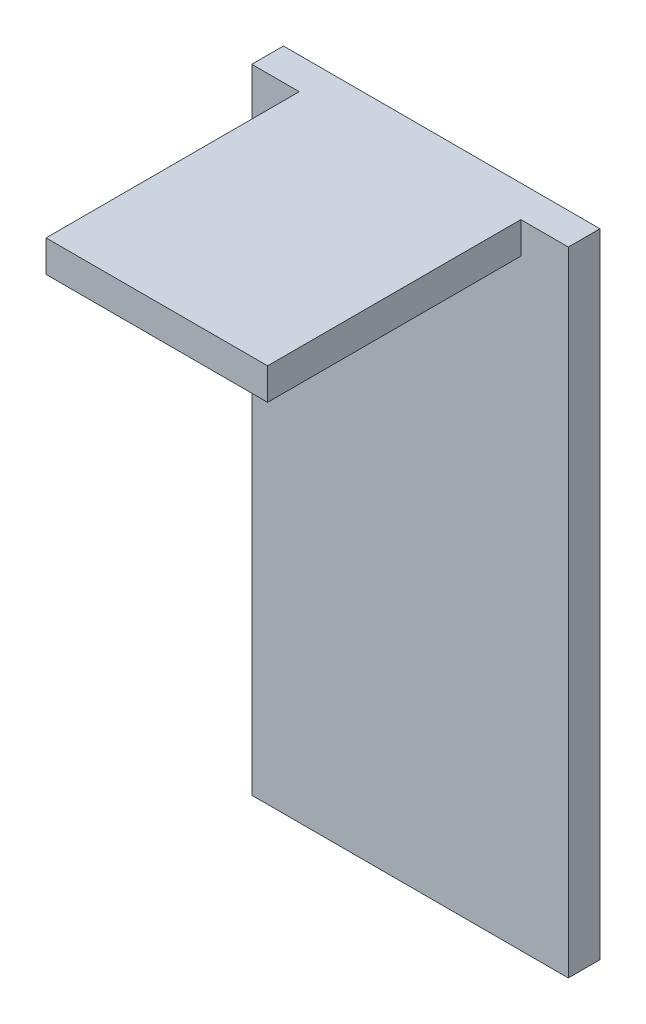
ISO-10303-21;
HEADER;
FILE_DESCRIPTION(('STEP AP214'),'2;1');
FILE_NAME('part.step','',(''),(''),'','','');
FILE_SCHEMA(('AUTOMOTIVE_DESIGN { 1 0 10303 214 1 1 1 1 }'));
ENDSEC;
DATA;
#1=APPLICATION_CONTEXT('core data for automotive mechanical design processes');
#2=APPLICATION_PROTOCOL_DEFINITION('international standard','automotive_design',2000,#1);
#3=PRODUCT_CONTEXT('',#1,'mechanical');
#4=PRODUCT('Part','Part','',(#3));
#5=PRODUCT_RELATED_PRODUCT_CATEGORY('part','',(#4));
#6=PRODUCT_DEFINITION_FORMATION('','',#4);
#7=PRODUCT_DEFINITION_CONTEXT('part definition',#1,'design');
#8=PRODUCT_DEFINITION('design','',#6,#7);
#9=PRODUCT_DEFINITION_SHAPE('','',#8);
#10=(LENGTH_UNIT() NAMED_UNIT(*) SI_UNIT(.MILLI.,.METRE.));
#11=(NAMED_UNIT(*) PLANE_ANGLE_UNIT() SI_UNIT($,.RADIAN.));
#12=(NAMED_UNIT(*) SI_UNIT($,.STERADIAN.) SOLID_ANGLE_UNIT());
#13=UNCERTAINTY_MEASURE_WITH_UNIT(LENGTH_MEASURE(1.E-05),#10,'distance_accuracy_value','');
#14=(GEOMETRIC_REPRESENTATION_CONTEXT(3) GLOBAL_UNCERTAINTY_ASSIGNED_CONTEXT((#13)) GLOBAL_UNIT_ASSIGNED_CONTEXT((#10,
#11,#12)) REPRESENTATION_CONTEXT('',''));
#15=CARTESIAN_POINT('',(0.,0.,0.));
#16=DIRECTION('',(0.,0.,1.));
#17=DIRECTION('',(1.,0.,0.));
#18=AXIS2_PLACEMENT_3D('',#15,#16,#17);
#19=CARTESIAN_POINT('',(0.,5.,0.));
#20=DIRECTION('',(1.,0.,0.));
#21=DIRECTION('',(0.,0.,-1.));
#22=AXIS2_PLACEMENT_3D('',#19,#20,#21);
#23=PLANE('',#22);
#24=DIRECTION('',(0.,0.,1.));
#25=VECTOR('',#24,1.);
#26=CARTESIAN_POINT('',(0.,0.,0.));
#27=LINE('',#26,#25);
#28=CARTESIAN_POINT('',(0.,0.,-40.));
#29=VERTEX_POINT('',#28);
#30=CARTESIAN_POINT('',(0.,0.,0.));
#31=VERTEX_POINT('',#30);
#32=EDGE_CURVE('E162',#29,#31,#27,.T.);
#33=ORIENTED_EDGE('',*,*,#32,.T.);
#34=DIRECTION('',(0.,-1.,0.));
#35=VECTOR('',#34,1.);
#36=CARTESIAN_POINT('',(0.,5.,0.));
#37=LINE('',#36,#35);
#38=CARTESIAN_POINT('',(0.,5.,0.));
#39=VERTEX_POINT('',#38);
#40=EDGE_CURVE('E11',#39,#31,#37,.T.);
#41=ORIENTED_EDGE('',*,*,#40,.F.);
#42=DIRECTION('',(0.,0.,1.));
#43=VECTOR('',#42,1.);
#44=CARTESIAN_POINT('',(0.,5.,0.));
#45=LINE('',#44,#43);
#46=CARTESIAN_POINT('',(0.,5.,-40.));
#47=VERTEX_POINT('',#46);
#48=EDGE_CURVE('E58',#47,#39,#45,.T.);
#49=ORIENTED_EDGE('',*,*,#48,.F.);
#50=DIRECTION('',(0.,-1.,0.));
#51=VECTOR('',#50,1.);
#52=CARTESIAN_POINT('',(0.,5.,-40.));
#53=LINE('',#52,#51);
#54=EDGE_CURVE('E76',#47,#29,#53,.T.);
#55=ORIENTED_EDGE('',*,*,#54,.T.);
#56=EDGE_LOOP('',(#33,#41,#49,#55));
#57=FACE_BOUND('',#56,.T.);
#58=ADVANCED_FACE('F41',(#57),#23,.F.);
#59=CARTESIAN_POINT('',(0.,5.,0.));
#60=DIRECTION('',(0.,0.,-1.));
#61=DIRECTION('',(-1.,0.,0.));
#62=AXIS2_PLACEMENT_3D('',#59,#60,#61);
#63=PLANE('',#62);
#64=DIRECTION('',(1.,0.,0.));
#65=VECTOR('',#64,1.);
#66=CARTESIAN_POINT('',(0.,0.,0.));
#67=LINE('',#66,#65);
#68=CARTESIAN_POINT('',(35.,0.,0.));
#69=VERTEX_POINT('',#68);
#70=EDGE_CURVE('E72',#31,#69,#67,.T.);
#71=ORIENTED_EDGE('',*,*,#70,.T.);
#72=DIRECTION('',(0.,-1.,0.));
#73=VECTOR('',#72,1.);
#74=CARTESIAN_POINT('',(35.,5.,0.));
#75=LINE('',#74,#73);
#76=CARTESIAN_POINT('',(35.,5.,0.));
#77=VERTEX_POINT('',#76);
#78=EDGE_CURVE('E50',#77,#69,#75,.T.);
#79=ORIENTED_EDGE('',*,*,#78,.F.);
#80=DIRECTION('',(1.,0.,0.));
#81=VECTOR('',#80,1.);
#82=CARTESIAN_POINT('',(0.,5.,0.));
#83=LINE('',#82,#81);
#84=EDGE_CURVE('E81',#39,#77,#83,.T.);
#85=ORIENTED_EDGE('',*,*,#84,.F.);
#86=ORIENTED_EDGE('',*,*,#40,.T.);
#87=EDGE_LOOP('',(#71,#79,#85,#86));
#88=FACE_BOUND('',#87,.T.);
#89=ADVANCED_FACE('F206',(#88),#63,.F.);
#90=CARTESIAN_POINT('',(35.,5.,0.));
#91=DIRECTION('',(-1.,0.,0.));
#92=DIRECTION('',(0.,0.,1.));
#93=AXIS2_PLACEMENT_3D('',#90,#91,#92);
#94=PLANE('',#93);
#95=DIRECTION('',(0.,0.,-1.));
#96=VECTOR('',#95,1.);
#97=CARTESIAN_POINT('',(35.,0.,0.));
#98=LINE('',#97,#96);
#99=CARTESIAN_POINT('',(35.,0.,-40.));
#100=VERTEX_POINT('',#99);
#101=EDGE_CURVE('E180',#69,#100,#98,.T.);
#102=ORIENTED_EDGE('',*,*,#101,.T.);
#103=DIRECTION('',(0.,-1.,0.));
#104=VECTOR('',#103,1.);
#105=CARTESIAN_POINT('',(35.,5.,-40.));
#106=LINE('',#105,#104);
#107=CARTESIAN_POINT('',(35.,5.,-40.));
#108=VERTEX_POINT('',#107);
#109=EDGE_CURVE('E189',#108,#100,#106,.T.);
#110=ORIENTED_EDGE('',*,*,#109,.F.);
#111=DIRECTION('',(0.,0.,-1.));
#112=VECTOR('',#111,1.);
#113=CARTESIAN_POINT('',(35.,5.,0.));
#114=LINE('',#113,#112);
#115=EDGE_CURVE('E173',#77,#108,#114,.T.);
#116=ORIENTED_EDGE('',*,*,#115,.F.);
#117=ORIENTED_EDGE('',*,*,#78,.T.);
#118=EDGE_LOOP('',(#102,#110,#116,#117));
#119=FACE_BOUND('',#118,.T.);
#120=ADVANCED_FACE('F196',(#119),#94,.F.);
#121=CARTESIAN_POINT('',(0.,5.,0.));
#122=DIRECTION('',(0.,-1.,0.));
#123=DIRECTION('',(0.,0.,-1.));
#124=AXIS2_PLACEMENT_3D('',#121,#122,#123);
#125=PLANE('',#124);
#126=ORIENTED_EDGE('',*,*,#48,.T.);
#127=ORIENTED_EDGE('',*,*,#84,.T.);
#128=ORIENTED_EDGE('',*,*,#115,.T.);
#129=DIRECTION('',(1.,0.,0.));
#130=VECTOR('',#129,1.);
#131=CARTESIAN_POINT('',(42.5,5.,-40.));
#132=LINE('',#131,#130);
#133=CARTESIAN_POINT('',(42.5,5.,-40.));
#134=VERTEX_POINT('',#133);
#135=EDGE_CURVE('E154',#108,#134,#132,.T.);
#136=ORIENTED_EDGE('',*,*,#135,.T.);
#137=DIRECTION('',(0.,0.,-1.));
#138=VECTOR('',#137,1.);
#139=CARTESIAN_POINT('',(42.5,5.,-45.));
#140=LINE('',#139,#138);
#141=CARTESIAN_POINT('',(42.5,5.,-45.));
#142=VERTEX_POINT('',#141);
#143=EDGE_CURVE('E144',#134,#142,#140,.T.);
#144=ORIENTED_EDGE('',*,*,#143,.T.);
#145=DIRECTION('',(-1.,0.,0.));
#146=VECTOR('',#145,1.);
#147=CARTESIAN_POINT('',(-7.49999999999999,5.,-45.));
#148=LINE('',#147,#146);
#149=CARTESIAN_POINT('',(-7.49999999999999,5.,-45.));
#150=VERTEX_POINT('',#149);
#151=EDGE_CURVE('E140',#142,#150,#148,.T.);
#152=ORIENTED_EDGE('',*,*,#151,.T.);
#153=DIRECTION('',(0.,0.,1.));
#154=VECTOR('',#153,1.);
#155=CARTESIAN_POINT('',(-7.49999999999999,5.,-40.));
#156=LINE('',#155,#154);
#157=CARTESIAN_POINT('',(-7.49999999999999,5.,-40.));
#158=VERTEX_POINT('',#157);
#159=EDGE_CURVE('E151',#150,#158,#156,.T.);
#160=ORIENTED_EDGE('',*,*,#159,.T.);
#161=EDGE_CURVE('E117',#158,#47,#132,.T.);
#162=ORIENTED_EDGE('',*,*,#161,.T.);
#163=EDGE_LOOP('',(#126,#127,#128,#136,#144,#152,#160,#162));
#164=FACE_BOUND('',#163,.T.);
#165=ADVANCED_FACE('F204',(#164),#125,.F.);
#166=CARTESIAN_POINT('',(0.,0.,0.));
#167=DIRECTION('',(0.,-1.,0.));
#168=DIRECTION('',(0.,0.,-1.));
#169=AXIS2_PLACEMENT_3D('',#166,#167,#168);
#170=PLANE('',#169);
#171=ORIENTED_EDGE('',*,*,#32,.F.);
#172=DIRECTION('',(-1.,0.,0.));
#173=VECTOR('',#172,1.);
#174=CARTESIAN_POINT('',(0.,0.,-40.));
#175=LINE('',#174,#173);
#176=EDGE_CURVE('E170',#100,#29,#175,.T.);
#177=ORIENTED_EDGE('',*,*,#176,.F.);
#178=ORIENTED_EDGE('',*,*,#101,.F.);
#179=ORIENTED_EDGE('',*,*,#70,.F.);
#180=EDGE_LOOP('',(#171,#177,#178,#179));
#181=FACE_BOUND('',#180,.T.);
#182=ADVANCED_FACE('F199',(#181),#170,.T.);
#183=CARTESIAN_POINT('',(42.5,-95.,-40.));
#184=DIRECTION('',(0.,0.,1.));
#185=DIRECTION('',(1.,0.,0.));
#186=AXIS2_PLACEMENT_3D('',#183,#184,#185);
#187=PLANE('',#186);
#188=ORIENTED_EDGE('',*,*,#54,.F.);
#189=ORIENTED_EDGE('',*,*,#161,.F.);
#190=DIRECTION('',(0.,1.,0.));
#191=VECTOR('',#190,1.);
#192=CARTESIAN_POINT('',(-7.49999999999999,-95.,-40.));
#193=LINE('',#192,#191);
#194=CARTESIAN_POINT('',(-7.49999999999999,-95.,-40.));
#195=VERTEX_POINT('',#194);
#196=EDGE_CURVE('E111',#195,#158,#193,.T.);
#197=ORIENTED_EDGE('',*,*,#196,.F.);
#198=DIRECTION('',(1.,0.,0.));
#199=VECTOR('',#198,1.);
#200=CARTESIAN_POINT('',(42.5,-95.,-40.));
#201=LINE('',#200,#199);
#202=CARTESIAN_POINT('',(42.5,-95.,-40.));
#203=VERTEX_POINT('',#202);
#204=EDGE_CURVE('E115',#195,#203,#201,.T.);
#205=ORIENTED_EDGE('',*,*,#204,.T.);
#206=DIRECTION('',(0.,1.,0.));
#207=VECTOR('',#206,1.);
#208=CARTESIAN_POINT('',(42.5,-95.,-40.));
#209=LINE('',#208,#207);
#210=EDGE_CURVE('E123',#203,#134,#209,.T.);
#211=ORIENTED_EDGE('',*,*,#210,.T.);
#212=ORIENTED_EDGE('',*,*,#135,.F.);
#213=ORIENTED_EDGE('',*,*,#109,.T.);
#214=ORIENTED_EDGE('',*,*,#176,.T.);
#215=EDGE_LOOP('',(#188,#189,#197,#205,#211,#212,#213,#214));
#216=FACE_BOUND('',#215,.T.);
#217=ADVANCED_FACE('F113',(#216),#187,.T.);
#218=CARTESIAN_POINT('',(-7.49999999999999,-95.,-40.));
#219=DIRECTION('',(-1.,0.,0.));
#220=DIRECTION('',(0.,0.,1.));
#221=AXIS2_PLACEMENT_3D('',#218,#219,#220);
#222=PLANE('',#221);
#223=ORIENTED_EDGE('',*,*,#159,.F.);
#224=DIRECTION('',(0.,1.,0.));
#225=VECTOR('',#224,1.);
#226=CARTESIAN_POINT('',(-7.49999999999999,-95.,-45.));
#227=LINE('',#226,#225);
#228=CARTESIAN_POINT('',(-7.49999999999999,-95.,-45.));
#229=VERTEX_POINT('',#228);
#230=EDGE_CURVE('E138',#229,#150,#227,.T.);
#231=ORIENTED_EDGE('',*,*,#230,.F.);
#232=DIRECTION('',(0.,0.,1.));
#233=VECTOR('',#232,1.);
#234=CARTESIAN_POINT('',(-7.49999999999999,-95.,-40.));
#235=LINE('',#234,#233);
#236=EDGE_CURVE('E131',#229,#195,#235,.T.);
#237=ORIENTED_EDGE('',*,*,#236,.T.);
#238=ORIENTED_EDGE('',*,*,#196,.T.);
#239=EDGE_LOOP('',(#223,#231,#237,#238));
#240=FACE_BOUND('',#239,.T.);
#241=ADVANCED_FACE('F137',(#240),#222,.T.);
#242=CARTESIAN_POINT('',(-7.49999999999999,-95.,-45.));
#243=DIRECTION('',(0.,0.,-1.));
#244=DIRECTION('',(-1.,0.,0.));
#245=AXIS2_PLACEMENT_3D('',#242,#243,#244);
#246=PLANE('',#245);
#247=ORIENTED_EDGE('',*,*,#151,.F.);
#248=DIRECTION('',(0.,1.,0.));
#249=VECTOR('',#248,1.);
#250=CARTESIAN_POINT('',(42.5,-95.,-45.));
#251=LINE('',#250,#249);
#252=CARTESIAN_POINT('',(42.5,-95.,-45.));
#253=VERTEX_POINT('',#252);
#254=EDGE_CURVE('E163',#253,#142,#251,.T.);
#255=ORIENTED_EDGE('',*,*,#254,.F.);
#256=DIRECTION('',(-1.,0.,0.));
#257=VECTOR('',#256,1.);
#258=CARTESIAN_POINT('',(-7.49999999999999,-95.,-45.));
#259=LINE('',#258,#257);
#260=EDGE_CURVE('E124',#253,#229,#259,.T.);
#261=ORIENTED_EDGE('',*,*,#260,.T.);
#262=ORIENTED_EDGE('',*,*,#230,.T.);
#263=EDGE_LOOP('',(#247,#255,#261,#262));
#264=FACE_BOUND('',#263,.T.);
#265=ADVANCED_FACE('F220',(#264),#246,.T.);
#266=CARTESIAN_POINT('',(42.5,-95.,-45.));
#267=DIRECTION('',(1.,0.,0.));
#268=DIRECTION('',(0.,0.,-1.));
#269=AXIS2_PLACEMENT_3D('',#266,#267,#268);
#270=PLANE('',#269);
#271=ORIENTED_EDGE('',*,*,#143,.F.);
#272=ORIENTED_EDGE('',*,*,#210,.F.);
#273=DIRECTION('',(0.,0.,-1.));
#274=VECTOR('',#273,1.);
#275=CARTESIAN_POINT('',(42.5,-95.,-45.));
#276=LINE('',#275,#274);
#277=EDGE_CURVE('E134',#203,#253,#276,.T.);
#278=ORIENTED_EDGE('',*,*,#277,.T.);
#279=ORIENTED_EDGE('',*,*,#254,.T.);
#280=EDGE_LOOP('',(#271,#272,#278,#279));
#281=FACE_BOUND('',#280,.T.);
#282=ADVANCED_FACE('F223',(#281),#270,.T.);
#283=CARTESIAN_POINT('',(0.,-95.,0.));
#284=DIRECTION('',(0.,-1.,0.));
#285=DIRECTION('',(0.,0.,-1.));
#286=AXIS2_PLACEMENT_3D('',#283,#284,#285);
#287=PLANE('',#286);
#288=ORIENTED_EDGE('',*,*,#236,.F.);
#289=ORIENTED_EDGE('',*,*,#260,.F.);
#290=ORIENTED_EDGE('',*,*,#277,.F.);
#291=ORIENTED_EDGE('',*,*,#204,.F.);
#292=EDGE_LOOP('',(#288,#289,#290,#291));
#293=FACE_BOUND('',#292,.T.);
#294=ADVANCED_FACE('F129',(#293),#287,.T.);
#295=CLOSED_SHELL('',(#58,#89,#120,#165,#182,#217,#241,#265,#282,#294));
#296=MANIFOLD_SOLID_BREP('B2',#295);
#297=ADVANCED_BREP_SHAPE_REPRESENTATION('',(#18,#296),#14);
#298=SHAPE_DEFINITION_REPRESENTATION(#9,#297);
ENDSEC;
END-ISO-10303-21;
